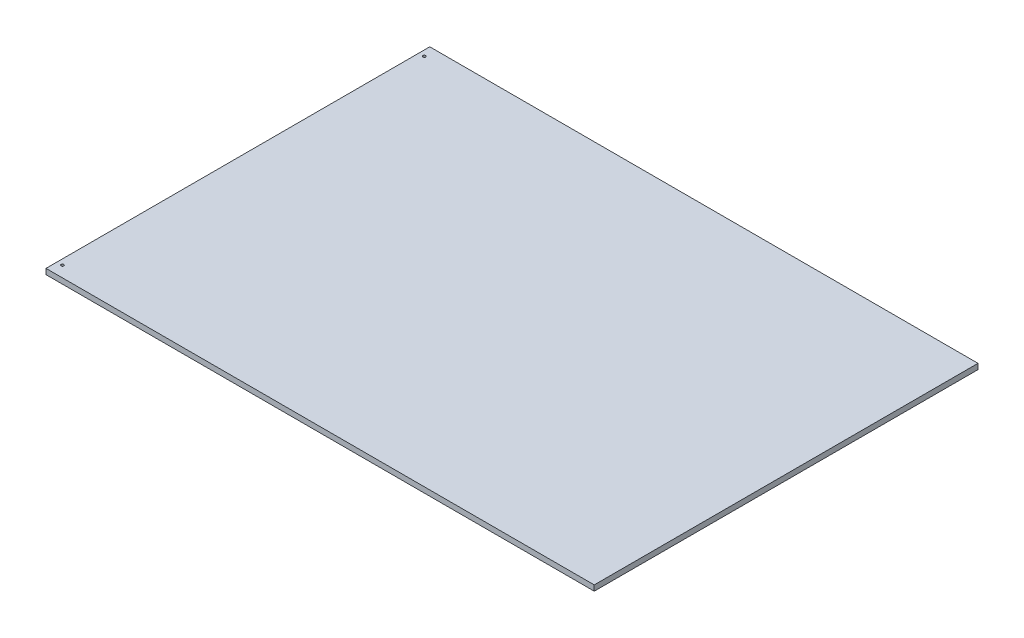
ISO-10303-21;
HEADER;
FILE_DESCRIPTION(('STEP AP214'),'2;1');
FILE_NAME('part.step','',(''),(''),'','','');
FILE_SCHEMA(('AUTOMOTIVE_DESIGN { 1 0 10303 214 1 1 1 1 }'));
ENDSEC;
DATA;
#1=APPLICATION_CONTEXT('core data for automotive mechanical design processes');
#2=APPLICATION_PROTOCOL_DEFINITION('international standard','automotive_design',2000,#1);
#3=PRODUCT_CONTEXT('',#1,'mechanical');
#4=PRODUCT('Part','Part','',(#3));
#5=PRODUCT_RELATED_PRODUCT_CATEGORY('part','',(#4));
#6=PRODUCT_DEFINITION_FORMATION('','',#4);
#7=PRODUCT_DEFINITION_CONTEXT('part definition',#1,'design');
#8=PRODUCT_DEFINITION('design','',#6,#7);
#9=PRODUCT_DEFINITION_SHAPE('','',#8);
#10=(LENGTH_UNIT() NAMED_UNIT(*) SI_UNIT(.MILLI.,.METRE.));
#11=(NAMED_UNIT(*) PLANE_ANGLE_UNIT() SI_UNIT($,.RADIAN.));
#12=(NAMED_UNIT(*) SI_UNIT($,.STERADIAN.) SOLID_ANGLE_UNIT());
#13=UNCERTAINTY_MEASURE_WITH_UNIT(LENGTH_MEASURE(1.E-05),#10,'distance_accuracy_value','');
#14=(GEOMETRIC_REPRESENTATION_CONTEXT(3) GLOBAL_UNCERTAINTY_ASSIGNED_CONTEXT((#13)) GLOBAL_UNIT_ASSIGNED_CONTEXT((#10,
#11,#12)) REPRESENTATION_CONTEXT('',''));
#15=CARTESIAN_POINT('',(0.,0.,0.));
#16=DIRECTION('',(0.,0.,1.));
#17=DIRECTION('',(1.,0.,0.));
#18=AXIS2_PLACEMENT_3D('',#15,#16,#17);
#19=CARTESIAN_POINT('',(0.,12.7,0.));
#20=DIRECTION('',(1.,0.,0.));
#21=DIRECTION('',(0.,0.,-1.));
#22=AXIS2_PLACEMENT_3D('',#19,#20,#21);
#23=PLANE('',#22);
#24=DIRECTION('',(0.,0.,1.));
#25=VECTOR('',#24,1.);
#26=CARTESIAN_POINT('',(0.,0.,0.));
#27=LINE('',#26,#25);
#28=CARTESIAN_POINT('',(0.,0.,-889.));
#29=VERTEX_POINT('',#28);
#30=CARTESIAN_POINT('',(0.,0.,0.));
#31=VERTEX_POINT('',#30);
#32=EDGE_CURVE('E110',#29,#31,#27,.T.);
#33=ORIENTED_EDGE('',*,*,#32,.T.);
#34=DIRECTION('',(0.,-1.,0.));
#35=VECTOR('',#34,1.);
#36=CARTESIAN_POINT('',(0.,12.7,0.));
#37=LINE('',#36,#35);
#38=CARTESIAN_POINT('',(0.,12.7,0.));
#39=VERTEX_POINT('',#38);
#40=EDGE_CURVE('E11',#39,#31,#37,.T.);
#41=ORIENTED_EDGE('',*,*,#40,.F.);
#42=DIRECTION('',(0.,0.,1.));
#43=VECTOR('',#42,1.);
#44=CARTESIAN_POINT('',(0.,12.7,0.));
#45=LINE('',#44,#43);
#46=CARTESIAN_POINT('',(0.,12.7,-889.));
#47=VERTEX_POINT('',#46);
#48=EDGE_CURVE('E93',#47,#39,#45,.T.);
#49=ORIENTED_EDGE('',*,*,#48,.F.);
#50=DIRECTION('',(0.,-1.,0.));
#51=VECTOR('',#50,1.);
#52=CARTESIAN_POINT('',(0.,12.7,-889.));
#53=LINE('',#52,#51);
#54=EDGE_CURVE('E106',#47,#29,#53,.T.);
#55=ORIENTED_EDGE('',*,*,#54,.T.);
#56=EDGE_LOOP('',(#33,#41,#49,#55));
#57=FACE_BOUND('',#56,.T.);
#58=ADVANCED_FACE('F39',(#57),#23,.F.);
#59=CARTESIAN_POINT('',(0.,12.7,0.));
#60=DIRECTION('',(0.,0.,-1.));
#61=DIRECTION('',(-1.,0.,0.));
#62=AXIS2_PLACEMENT_3D('',#59,#60,#61);
#63=PLANE('',#62);
#64=DIRECTION('',(1.,0.,0.));
#65=VECTOR('',#64,1.);
#66=CARTESIAN_POINT('',(0.,0.,0.));
#67=LINE('',#66,#65);
#68=CARTESIAN_POINT('',(1270.,0.,0.));
#69=VERTEX_POINT('',#68);
#70=EDGE_CURVE('E98',#31,#69,#67,.T.);
#71=ORIENTED_EDGE('',*,*,#70,.T.);
#72=DIRECTION('',(0.,-1.,0.));
#73=VECTOR('',#72,1.);
#74=CARTESIAN_POINT('',(1270.,12.7,0.));
#75=LINE('',#74,#73);
#76=CARTESIAN_POINT('',(1270.,12.7,0.));
#77=VERTEX_POINT('',#76);
#78=EDGE_CURVE('E49',#77,#69,#75,.T.);
#79=ORIENTED_EDGE('',*,*,#78,.F.);
#80=DIRECTION('',(1.,0.,0.));
#81=VECTOR('',#80,1.);
#82=CARTESIAN_POINT('',(0.,12.7,0.));
#83=LINE('',#82,#81);
#84=EDGE_CURVE('E88',#39,#77,#83,.T.);
#85=ORIENTED_EDGE('',*,*,#84,.F.);
#86=ORIENTED_EDGE('',*,*,#40,.T.);
#87=EDGE_LOOP('',(#71,#79,#85,#86));
#88=FACE_BOUND('',#87,.T.);
#89=ADVANCED_FACE('F97',(#88),#63,.F.);
#90=CARTESIAN_POINT('',(1270.,12.7,0.));
#91=DIRECTION('',(-1.,0.,0.));
#92=DIRECTION('',(0.,0.,1.));
#93=AXIS2_PLACEMENT_3D('',#90,#91,#92);
#94=PLANE('',#93);
#95=DIRECTION('',(0.,0.,-1.));
#96=VECTOR('',#95,1.);
#97=CARTESIAN_POINT('',(1270.,0.,0.));
#98=LINE('',#97,#96);
#99=CARTESIAN_POINT('',(1270.,0.,-889.));
#100=VERTEX_POINT('',#99);
#101=EDGE_CURVE('E75',#69,#100,#98,.T.);
#102=ORIENTED_EDGE('',*,*,#101,.T.);
#103=DIRECTION('',(0.,-1.,0.));
#104=VECTOR('',#103,1.);
#105=CARTESIAN_POINT('',(1270.,12.7,-889.));
#106=LINE('',#105,#104);
#107=CARTESIAN_POINT('',(1270.,12.7,-889.));
#108=VERTEX_POINT('',#107);
#109=EDGE_CURVE('E100',#108,#100,#106,.T.);
#110=ORIENTED_EDGE('',*,*,#109,.F.);
#111=DIRECTION('',(0.,0.,-1.));
#112=VECTOR('',#111,1.);
#113=CARTESIAN_POINT('',(1270.,12.7,0.));
#114=LINE('',#113,#112);
#115=EDGE_CURVE('E91',#77,#108,#114,.T.);
#116=ORIENTED_EDGE('',*,*,#115,.F.);
#117=ORIENTED_EDGE('',*,*,#78,.T.);
#118=EDGE_LOOP('',(#102,#110,#116,#117));
#119=FACE_BOUND('',#118,.T.);
#120=ADVANCED_FACE('F102',(#119),#94,.F.);
#121=CARTESIAN_POINT('',(0.,12.7,-889.));
#122=DIRECTION('',(0.,0.,1.));
#123=DIRECTION('',(1.,0.,0.));
#124=AXIS2_PLACEMENT_3D('',#121,#122,#123);
#125=PLANE('',#124);
#126=DIRECTION('',(-1.,0.,0.));
#127=VECTOR('',#126,1.);
#128=CARTESIAN_POINT('',(0.,0.,-889.));
#129=LINE('',#128,#127);
#130=EDGE_CURVE('E81',#100,#29,#129,.T.);
#131=ORIENTED_EDGE('',*,*,#130,.T.);
#132=ORIENTED_EDGE('',*,*,#54,.F.);
#133=DIRECTION('',(-1.,0.,0.));
#134=VECTOR('',#133,1.);
#135=CARTESIAN_POINT('',(0.,12.7,-889.));
#136=LINE('',#135,#134);
#137=EDGE_CURVE('E58',#108,#47,#136,.T.);
#138=ORIENTED_EDGE('',*,*,#137,.F.);
#139=ORIENTED_EDGE('',*,*,#109,.T.);
#140=EDGE_LOOP('',(#131,#132,#138,#139));
#141=FACE_BOUND('',#140,.T.);
#142=ADVANCED_FACE('F147',(#141),#125,.F.);
#143=CARTESIAN_POINT('',(0.,12.7,0.));
#144=DIRECTION('',(0.,-1.,0.));
#145=DIRECTION('',(0.,0.,-1.));
#146=AXIS2_PLACEMENT_3D('',#143,#144,#145);
#147=PLANE('',#146);
#148=CARTESIAN_POINT('',(12.7,12.7,-863.6));
#149=DIRECTION('',(0.,1.,0.));
#150=DIRECTION('',(0.,0.,1.));
#151=AXIS2_PLACEMENT_3D('',#148,#149,#150);
#152=CIRCLE('',#151,3.175);
#153=CARTESIAN_POINT('',(12.7,12.7,-860.425));
#154=VERTEX_POINT('',#153);
#155=EDGE_CURVE('E126',#154,#154,#152,.T.);
#156=ORIENTED_EDGE('',*,*,#155,.F.);
#157=EDGE_LOOP('',(#156));
#158=FACE_BOUND('',#157,.T.);
#159=CARTESIAN_POINT('',(12.7,12.7,-25.4));
#160=DIRECTION('',(0.,1.,0.));
#161=DIRECTION('',(0.,0.,-1.));
#162=AXIS2_PLACEMENT_3D('',#159,#160,#161);
#163=CIRCLE('',#162,3.17499999999999);
#164=CARTESIAN_POINT('',(12.7,12.7,-28.575));
#165=VERTEX_POINT('',#164);
#166=EDGE_CURVE('E133',#165,#165,#163,.T.);
#167=ORIENTED_EDGE('',*,*,#166,.F.);
#168=EDGE_LOOP('',(#167));
#169=FACE_BOUND('',#168,.T.);
#170=ORIENTED_EDGE('',*,*,#48,.T.);
#171=ORIENTED_EDGE('',*,*,#84,.T.);
#172=ORIENTED_EDGE('',*,*,#115,.T.);
#173=ORIENTED_EDGE('',*,*,#137,.T.);
#174=EDGE_LOOP('',(#170,#171,#172,#173));
#175=FACE_BOUND('',#174,.T.);
#176=ADVANCED_FACE('F89',(#158,#169,#175),#147,.F.);
#177=CARTESIAN_POINT('',(0.,0.,0.));
#178=DIRECTION('',(0.,-1.,0.));
#179=DIRECTION('',(0.,0.,-1.));
#180=AXIS2_PLACEMENT_3D('',#177,#178,#179);
#181=PLANE('',#180);
#182=CARTESIAN_POINT('',(12.7,0.,-863.6));
#183=DIRECTION('',(0.,-1.,0.));
#184=DIRECTION('',(0.,0.,-1.));
#185=AXIS2_PLACEMENT_3D('',#182,#183,#184);
#186=CIRCLE('',#185,3.175);
#187=CARTESIAN_POINT('',(12.7,0.,-866.775));
#188=VERTEX_POINT('',#187);
#189=EDGE_CURVE('E42',#188,#188,#186,.T.);
#190=ORIENTED_EDGE('',*,*,#189,.F.);
#191=EDGE_LOOP('',(#190));
#192=FACE_BOUND('',#191,.T.);
#193=CARTESIAN_POINT('',(12.7,0.,-25.4));
#194=DIRECTION('',(0.,-1.,0.));
#195=DIRECTION('',(0.,0.,-1.));
#196=AXIS2_PLACEMENT_3D('',#193,#194,#195);
#197=CIRCLE('',#196,3.17499999999999);
#198=CARTESIAN_POINT('',(12.7,0.,-28.575));
#199=VERTEX_POINT('',#198);
#200=EDGE_CURVE('E123',#199,#199,#197,.T.);
#201=ORIENTED_EDGE('',*,*,#200,.F.);
#202=EDGE_LOOP('',(#201));
#203=FACE_BOUND('',#202,.T.);
#204=ORIENTED_EDGE('',*,*,#32,.F.);
#205=ORIENTED_EDGE('',*,*,#130,.F.);
#206=ORIENTED_EDGE('',*,*,#101,.F.);
#207=ORIENTED_EDGE('',*,*,#70,.F.);
#208=EDGE_LOOP('',(#204,#205,#206,#207));
#209=FACE_BOUND('',#208,.T.);
#210=ADVANCED_FACE('F146',(#192,#203,#209),#181,.T.);
#211=CARTESIAN_POINT('',(12.7,-1209.802,-25.4));
#212=DIRECTION('',(0.,1.,0.));
#213=DIRECTION('',(0.,0.,1.));
#214=AXIS2_PLACEMENT_3D('',#211,#212,#213);
#215=CYLINDRICAL_SURFACE('',#214,3.17499999999999);
#216=ORIENTED_EDGE('',*,*,#200,.T.);
#217=EDGE_LOOP('',(#216));
#218=FACE_BOUND('',#217,.T.);
#219=ORIENTED_EDGE('',*,*,#166,.T.);
#220=EDGE_LOOP('',(#219));
#221=FACE_BOUND('',#220,.T.);
#222=ADVANCED_FACE('F143',(#218,#221),#215,.F.);
#223=CARTESIAN_POINT('',(12.7,-1209.802,-863.6));
#224=DIRECTION('',(0.,1.,0.));
#225=DIRECTION('',(0.,0.,1.));
#226=AXIS2_PLACEMENT_3D('',#223,#224,#225);
#227=CYLINDRICAL_SURFACE('',#226,3.175);
#228=ORIENTED_EDGE('',*,*,#189,.T.);
#229=EDGE_LOOP('',(#228));
#230=FACE_BOUND('',#229,.T.);
#231=ORIENTED_EDGE('',*,*,#155,.T.);
#232=EDGE_LOOP('',(#231));
#233=FACE_BOUND('',#232,.T.);
#234=ADVANCED_FACE('F194',(#230,#233),#227,.F.);
#235=CLOSED_SHELL('',(#58,#89,#120,#142,#176,#210,#222,#234));
#236=MANIFOLD_SOLID_BREP('B2',#235);
#237=ADVANCED_BREP_SHAPE_REPRESENTATION('',(#18,#236),#14);
#238=SHAPE_DEFINITION_REPRESENTATION(#9,#237);
ENDSEC;
END-ISO-10303-21;
